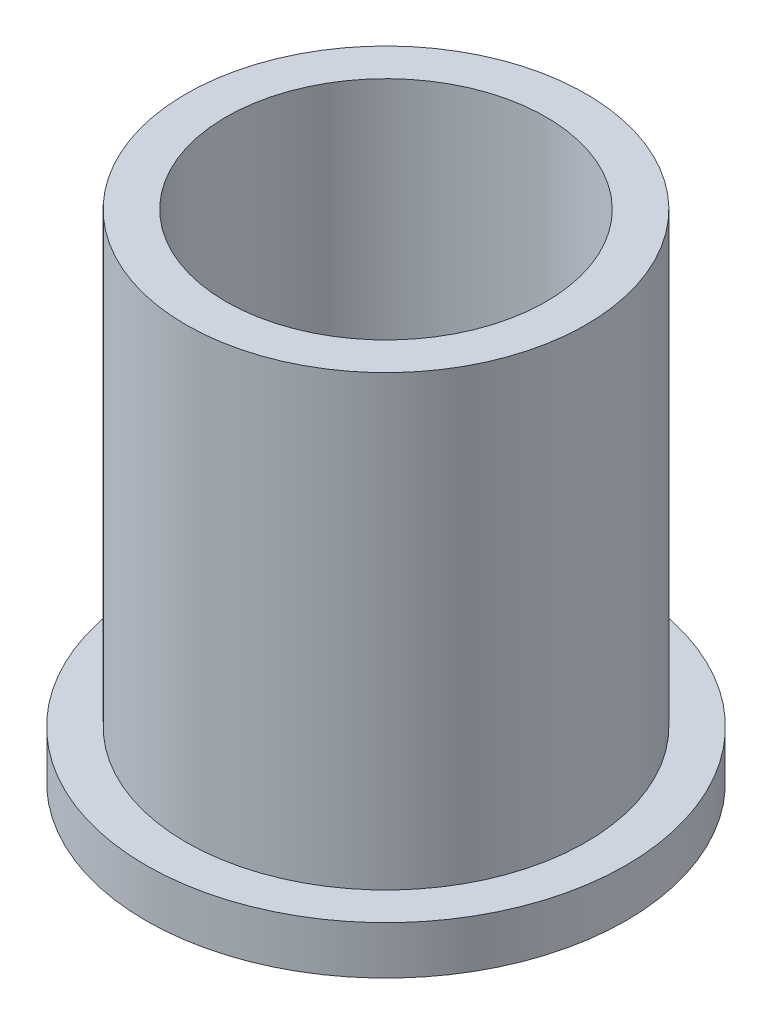
ISO-10303-21;
HEADER;
FILE_DESCRIPTION(('STEP AP214'),'2;1');
FILE_NAME('part.step','',(''),(''),'','','');
FILE_SCHEMA(('AUTOMOTIVE_DESIGN { 1 0 10303 214 1 1 1 1 }'));
ENDSEC;
DATA;
#1=APPLICATION_CONTEXT('core data for automotive mechanical design processes');
#2=APPLICATION_PROTOCOL_DEFINITION('international standard','automotive_design',2000,#1);
#3=PRODUCT_CONTEXT('',#1,'mechanical');
#4=PRODUCT('Part','Part','',(#3));
#5=PRODUCT_RELATED_PRODUCT_CATEGORY('part','',(#4));
#6=PRODUCT_DEFINITION_FORMATION('','',#4);
#7=PRODUCT_DEFINITION_CONTEXT('part definition',#1,'design');
#8=PRODUCT_DEFINITION('design','',#6,#7);
#9=PRODUCT_DEFINITION_SHAPE('','',#8);
#10=(LENGTH_UNIT() NAMED_UNIT(*) SI_UNIT(.MILLI.,.METRE.));
#11=(NAMED_UNIT(*) PLANE_ANGLE_UNIT() SI_UNIT($,.RADIAN.));
#12=(NAMED_UNIT(*) SI_UNIT($,.STERADIAN.) SOLID_ANGLE_UNIT());
#13=UNCERTAINTY_MEASURE_WITH_UNIT(LENGTH_MEASURE(1.E-05),#10,'distance_accuracy_value','');
#14=(GEOMETRIC_REPRESENTATION_CONTEXT(3) GLOBAL_UNCERTAINTY_ASSIGNED_CONTEXT((#13)) GLOBAL_UNIT_ASSIGNED_CONTEXT((#10,
#11,#12)) REPRESENTATION_CONTEXT('',''));
#15=CARTESIAN_POINT('',(0.,0.,0.));
#16=DIRECTION('',(0.,0.,1.));
#17=DIRECTION('',(1.,0.,0.));
#18=AXIS2_PLACEMENT_3D('',#15,#16,#17);
#19=CARTESIAN_POINT('',(0.,3.,0.));
#20=DIRECTION('',(0.,-1.,0.));
#21=DIRECTION('',(0.,0.,-1.));
#22=AXIS2_PLACEMENT_3D('',#19,#20,#21);
#23=CYLINDRICAL_SURFACE('',#22,15.);
#24=CARTESIAN_POINT('',(0.,3.,0.));
#25=DIRECTION('',(0.,1.,0.));
#26=DIRECTION('',(0.,0.,1.));
#27=AXIS2_PLACEMENT_3D('',#24,#25,#26);
#28=CIRCLE('',#27,15.);
#29=CARTESIAN_POINT('',(0.,3.,15.));
#30=VERTEX_POINT('',#29);
#31=EDGE_CURVE('E10',#30,#30,#28,.T.);
#32=ORIENTED_EDGE('',*,*,#31,.F.);
#33=EDGE_LOOP('',(#32));
#34=FACE_BOUND('',#33,.T.);
#35=CARTESIAN_POINT('',(0.,0.,0.));
#36=DIRECTION('',(0.,1.,0.));
#37=DIRECTION('',(0.,0.,1.));
#38=AXIS2_PLACEMENT_3D('',#35,#36,#37);
#39=CIRCLE('',#38,15.);
#40=CARTESIAN_POINT('',(0.,0.,15.));
#41=VERTEX_POINT('',#40);
#42=EDGE_CURVE('E44',#41,#41,#39,.T.);
#43=ORIENTED_EDGE('',*,*,#42,.T.);
#44=EDGE_LOOP('',(#43));
#45=FACE_BOUND('',#44,.T.);
#46=ADVANCED_FACE('F41',(#34,#45),#23,.T.);
#47=CARTESIAN_POINT('',(0.,3.,0.));
#48=DIRECTION('',(0.,1.,0.));
#49=DIRECTION('',(0.,0.,1.));
#50=AXIS2_PLACEMENT_3D('',#47,#48,#49);
#51=PLANE('',#50);
#52=CARTESIAN_POINT('',(0.,3.,0.));
#53=DIRECTION('',(0.,1.,0.));
#54=DIRECTION('',(0.,0.,1.));
#55=AXIS2_PLACEMENT_3D('',#52,#53,#54);
#56=CIRCLE('',#55,12.5);
#57=CARTESIAN_POINT('',(0.,3.,12.5));
#58=VERTEX_POINT('',#57);
#59=EDGE_CURVE('E49',#58,#58,#56,.T.);
#60=ORIENTED_EDGE('',*,*,#59,.F.);
#61=EDGE_LOOP('',(#60));
#62=FACE_BOUND('',#61,.T.);
#63=ORIENTED_EDGE('',*,*,#31,.T.);
#64=EDGE_LOOP('',(#63));
#65=FACE_BOUND('',#64,.T.);
#66=ADVANCED_FACE('F88',(#62,#65),#51,.T.);
#67=CARTESIAN_POINT('',(0.,0.,0.));
#68=DIRECTION('',(0.,1.,0.));
#69=DIRECTION('',(0.,0.,1.));
#70=AXIS2_PLACEMENT_3D('',#67,#68,#69);
#71=PLANE('',#70);
#72=ORIENTED_EDGE('',*,*,#42,.F.);
#73=EDGE_LOOP('',(#72));
#74=FACE_BOUND('',#73,.T.);
#75=CARTESIAN_POINT('',(0.,0.,0.));
#76=DIRECTION('',(0.,1.,0.));
#77=DIRECTION('',(0.,0.,1.));
#78=AXIS2_PLACEMENT_3D('',#75,#76,#77);
#79=CIRCLE('',#78,10.);
#80=CARTESIAN_POINT('',(0.,0.,10.));
#81=VERTEX_POINT('',#80);
#82=EDGE_CURVE('E56',#81,#81,#79,.T.);
#83=ORIENTED_EDGE('',*,*,#82,.T.);
#84=EDGE_LOOP('',(#83));
#85=FACE_BOUND('',#84,.T.);
#86=ADVANCED_FACE('F85',(#74,#85),#71,.F.);
#87=CARTESIAN_POINT('',(0.,31.,0.));
#88=DIRECTION('',(0.,-1.,0.));
#89=DIRECTION('',(0.,0.,-1.));
#90=AXIS2_PLACEMENT_3D('',#87,#88,#89);
#91=CYLINDRICAL_SURFACE('',#90,10.);
#92=CARTESIAN_POINT('',(0.,31.,0.));
#93=DIRECTION('',(0.,1.,0.));
#94=DIRECTION('',(0.,0.,1.));
#95=AXIS2_PLACEMENT_3D('',#92,#93,#94);
#96=CIRCLE('',#95,10.);
#97=CARTESIAN_POINT('',(0.,31.,10.));
#98=VERTEX_POINT('',#97);
#99=EDGE_CURVE('E60',#98,#98,#96,.T.);
#100=ORIENTED_EDGE('',*,*,#99,.T.);
#101=EDGE_LOOP('',(#100));
#102=FACE_BOUND('',#101,.T.);
#103=ORIENTED_EDGE('',*,*,#82,.F.);
#104=EDGE_LOOP('',(#103));
#105=FACE_BOUND('',#104,.T.);
#106=ADVANCED_FACE('F69',(#102,#105),#91,.F.);
#107=CARTESIAN_POINT('',(0.,31.,0.));
#108=DIRECTION('',(0.,-1.,0.));
#109=DIRECTION('',(0.,0.,-1.));
#110=AXIS2_PLACEMENT_3D('',#107,#108,#109);
#111=CYLINDRICAL_SURFACE('',#110,12.5);
#112=ORIENTED_EDGE('',*,*,#59,.T.);
#113=EDGE_LOOP('',(#112));
#114=FACE_BOUND('',#113,.T.);
#115=CARTESIAN_POINT('',(0.,31.,0.));
#116=DIRECTION('',(0.,1.,0.));
#117=DIRECTION('',(0.,0.,1.));
#118=AXIS2_PLACEMENT_3D('',#115,#116,#117);
#119=CIRCLE('',#118,12.5);
#120=CARTESIAN_POINT('',(0.,31.,12.5));
#121=VERTEX_POINT('',#120);
#122=EDGE_CURVE('E61',#121,#121,#119,.T.);
#123=ORIENTED_EDGE('',*,*,#122,.F.);
#124=EDGE_LOOP('',(#123));
#125=FACE_BOUND('',#124,.T.);
#126=ADVANCED_FACE('F75',(#114,#125),#111,.T.);
#127=CARTESIAN_POINT('',(0.,31.,0.));
#128=DIRECTION('',(0.,1.,0.));
#129=DIRECTION('',(0.,0.,1.));
#130=AXIS2_PLACEMENT_3D('',#127,#128,#129);
#131=PLANE('',#130);
#132=ORIENTED_EDGE('',*,*,#99,.F.);
#133=EDGE_LOOP('',(#132));
#134=FACE_BOUND('',#133,.T.);
#135=ORIENTED_EDGE('',*,*,#122,.T.);
#136=EDGE_LOOP('',(#135));
#137=FACE_BOUND('',#136,.T.);
#138=ADVANCED_FACE('F72',(#134,#137),#131,.T.);
#139=CLOSED_SHELL('',(#46,#66,#86,#106,#126,#138));
#140=MANIFOLD_SOLID_BREP('B2',#139);
#141=ADVANCED_BREP_SHAPE_REPRESENTATION('',(#18,#140),#14);
#142=SHAPE_DEFINITION_REPRESENTATION(#9,#141);
ENDSEC;
END-ISO-10303-21;
